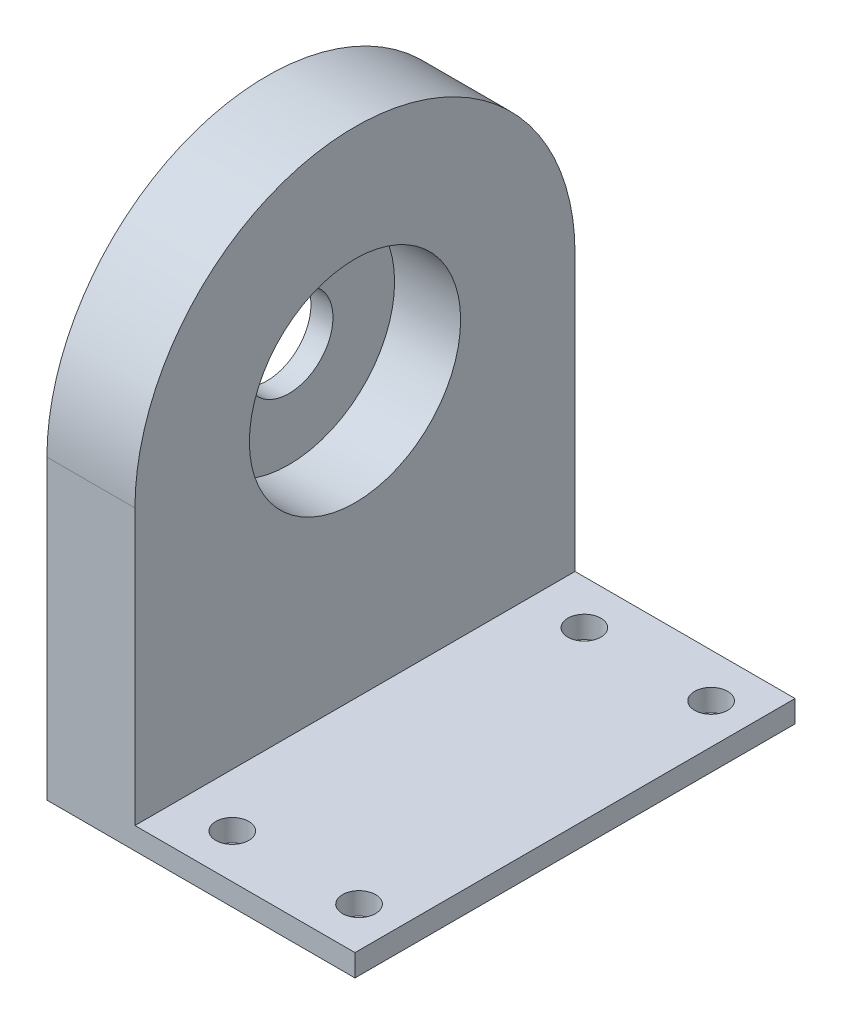
ISO-10303-21;
HEADER;
FILE_DESCRIPTION(('STEP AP214'),'2;1');
FILE_NAME('part.step','',(''),(''),'','','');
FILE_SCHEMA(('AUTOMOTIVE_DESIGN { 1 0 10303 214 1 1 1 1 }'));
ENDSEC;
DATA;
#1=APPLICATION_CONTEXT('core data for automotive mechanical design processes');
#2=APPLICATION_PROTOCOL_DEFINITION('international standard','automotive_design',2000,#1);
#3=PRODUCT_CONTEXT('',#1,'mechanical');
#4=PRODUCT('Part','Part','',(#3));
#5=PRODUCT_RELATED_PRODUCT_CATEGORY('part','',(#4));
#6=PRODUCT_DEFINITION_FORMATION('','',#4);
#7=PRODUCT_DEFINITION_CONTEXT('part definition',#1,'design');
#8=PRODUCT_DEFINITION('design','',#6,#7);
#9=PRODUCT_DEFINITION_SHAPE('','',#8);
#10=(LENGTH_UNIT() NAMED_UNIT(*) SI_UNIT(.MILLI.,.METRE.));
#11=(NAMED_UNIT(*) PLANE_ANGLE_UNIT() SI_UNIT($,.RADIAN.));
#12=(NAMED_UNIT(*) SI_UNIT($,.STERADIAN.) SOLID_ANGLE_UNIT());
#13=UNCERTAINTY_MEASURE_WITH_UNIT(LENGTH_MEASURE(1.E-05),#10,'distance_accuracy_value','');
#14=(GEOMETRIC_REPRESENTATION_CONTEXT(3) GLOBAL_UNCERTAINTY_ASSIGNED_CONTEXT((#13)) GLOBAL_UNIT_ASSIGNED_CONTEXT((#10,
#11,#12)) REPRESENTATION_CONTEXT('',''));
#15=CARTESIAN_POINT('',(0.,0.,0.));
#16=DIRECTION('',(0.,0.,1.));
#17=DIRECTION('',(1.,0.,0.));
#18=AXIS2_PLACEMENT_3D('',#15,#16,#17);
#19=CARTESIAN_POINT('',(-2.,9.08333333333333,5.25));
#20=DIRECTION('',(1.,0.,0.));
#21=DIRECTION('',(0.,0.,-1.));
#22=AXIS2_PLACEMENT_3D('',#19,#20,#21);
#23=CYLINDRICAL_SURFACE('',#22,20.);
#24=DIRECTION('',(1.,0.,0.));
#25=VECTOR('',#24,1.);
#26=CARTESIAN_POINT('',(-2.,9.08333333333333,25.25));
#27=LINE('',#26,#25);
#28=CARTESIAN_POINT('',(-2.,9.08333333333333,25.25));
#29=VERTEX_POINT('',#28);
#30=CARTESIAN_POINT('',(6.,9.08333333333333,25.25));
#31=VERTEX_POINT('',#30);
#32=EDGE_CURVE('E99',#29,#31,#27,.T.);
#33=ORIENTED_EDGE('',*,*,#32,.T.);
#34=CARTESIAN_POINT('',(6.,9.08333333333333,5.25));
#35=DIRECTION('',(1.,0.,0.));
#36=DIRECTION('',(0.,0.,-1.));
#37=AXIS2_PLACEMENT_3D('',#34,#35,#36);
#38=CIRCLE('',#37,20.);
#39=CARTESIAN_POINT('',(6.,9.08333333333333,-14.75));
#40=VERTEX_POINT('',#39);
#41=EDGE_CURVE('E132',#40,#31,#38,.T.);
#42=ORIENTED_EDGE('',*,*,#41,.F.);
#43=DIRECTION('',(1.,0.,0.));
#44=VECTOR('',#43,1.);
#45=CARTESIAN_POINT('',(-2.,9.08333333333333,-14.75));
#46=LINE('',#45,#44);
#47=CARTESIAN_POINT('',(-2.,9.08333333333333,-14.75));
#48=VERTEX_POINT('',#47);
#49=EDGE_CURVE('E11',#48,#40,#46,.T.);
#50=ORIENTED_EDGE('',*,*,#49,.F.);
#51=CARTESIAN_POINT('',(-2.,9.08333333333333,5.25));
#52=DIRECTION('',(1.,0.,0.));
#53=DIRECTION('',(0.,0.,-1.));
#54=AXIS2_PLACEMENT_3D('',#51,#52,#53);
#55=CIRCLE('',#54,20.);
#56=EDGE_CURVE('E141',#48,#29,#55,.T.);
#57=ORIENTED_EDGE('',*,*,#56,.T.);
#58=EDGE_LOOP('',(#33,#42,#50,#57));
#59=FACE_BOUND('',#58,.T.);
#60=ADVANCED_FACE('F34',(#59),#23,.T.);
#61=CARTESIAN_POINT('',(-2.,9.08333333333333,-14.75));
#62=DIRECTION('',(0.,0.,-1.));
#63=DIRECTION('',(-1.,0.,0.));
#64=AXIS2_PLACEMENT_3D('',#61,#62,#63);
#65=PLANE('',#64);
#66=ORIENTED_EDGE('',*,*,#49,.T.);
#67=DIRECTION('',(0.,1.,0.));
#68=VECTOR('',#67,1.);
#69=CARTESIAN_POINT('',(6.,9.08333333333333,-14.75));
#70=LINE('',#69,#68);
#71=CARTESIAN_POINT('',(6.,-15.9166666666667,-14.75));
#72=VERTEX_POINT('',#71);
#73=EDGE_CURVE('E139',#72,#40,#70,.T.);
#74=ORIENTED_EDGE('',*,*,#73,.F.);
#75=DIRECTION('',(-1.,0.,0.));
#76=VECTOR('',#75,1.);
#77=CARTESIAN_POINT('',(26.,-15.9166666666667,-14.75));
#78=LINE('',#77,#76);
#79=CARTESIAN_POINT('',(26.,-15.9166666666667,-14.75));
#80=VERTEX_POINT('',#79);
#81=EDGE_CURVE('E122',#80,#72,#78,.T.);
#82=ORIENTED_EDGE('',*,*,#81,.F.);
#83=DIRECTION('',(0.,1.,0.));
#84=VECTOR('',#83,1.);
#85=CARTESIAN_POINT('',(26.,-17.9166666666667,-14.75));
#86=LINE('',#85,#84);
#87=CARTESIAN_POINT('',(26.,-17.9166666666667,-14.75));
#88=VERTEX_POINT('',#87);
#89=EDGE_CURVE('E106',#88,#80,#86,.T.);
#90=ORIENTED_EDGE('',*,*,#89,.F.);
#91=DIRECTION('',(1.,0.,0.));
#92=VECTOR('',#91,1.);
#93=CARTESIAN_POINT('',(-2.,-17.9166666666667,-14.75));
#94=LINE('',#93,#92);
#95=CARTESIAN_POINT('',(-2.,-17.9166666666667,-14.75));
#96=VERTEX_POINT('',#95);
#97=EDGE_CURVE('E42',#96,#88,#94,.T.);
#98=ORIENTED_EDGE('',*,*,#97,.F.);
#99=DIRECTION('',(0.,1.,0.));
#100=VECTOR('',#99,1.);
#101=CARTESIAN_POINT('',(-2.,9.08333333333333,-14.75));
#102=LINE('',#101,#100);
#103=EDGE_CURVE('E146',#96,#48,#102,.T.);
#104=ORIENTED_EDGE('',*,*,#103,.T.);
#105=EDGE_LOOP('',(#66,#74,#82,#90,#98,#104));
#106=FACE_BOUND('',#105,.T.);
#107=ADVANCED_FACE('F154',(#106),#65,.T.);
#108=CARTESIAN_POINT('',(-2.,-17.9166666666667,25.25));
#109=DIRECTION('',(0.,-1.,0.));
#110=DIRECTION('',(0.,0.,-1.));
#111=AXIS2_PLACEMENT_3D('',#108,#109,#110);
#112=PLANE('',#111);
#113=CARTESIAN_POINT('',(10.8479228596359,-17.9166666666667,21.25));
#114=DIRECTION('',(0.,-1.,0.));
#115=DIRECTION('',(0.,0.,-1.));
#116=AXIS2_PLACEMENT_3D('',#113,#114,#115);
#117=CIRCLE('',#116,1.5);
#118=CARTESIAN_POINT('',(10.8479228596359,-17.9166666666667,19.75));
#119=VERTEX_POINT('',#118);
#120=EDGE_CURVE('E113',#119,#119,#117,.T.);
#121=ORIENTED_EDGE('',*,*,#120,.F.);
#122=EDGE_LOOP('',(#121));
#123=FACE_BOUND('',#122,.T.);
#124=CARTESIAN_POINT('',(22.368694263277,-17.9166666666667,21.25));
#125=DIRECTION('',(0.,-1.,0.));
#126=DIRECTION('',(0.,0.,-1.));
#127=AXIS2_PLACEMENT_3D('',#124,#125,#126);
#128=CIRCLE('',#127,1.5);
#129=CARTESIAN_POINT('',(22.368694263277,-17.9166666666667,19.75));
#130=VERTEX_POINT('',#129);
#131=EDGE_CURVE('E185',#130,#130,#128,.T.);
#132=ORIENTED_EDGE('',*,*,#131,.F.);
#133=EDGE_LOOP('',(#132));
#134=FACE_BOUND('',#133,.T.);
#135=CARTESIAN_POINT('',(22.368694263277,-17.9166666666667,-10.75));
#136=DIRECTION('',(0.,-1.,0.));
#137=DIRECTION('',(0.,0.,-1.));
#138=AXIS2_PLACEMENT_3D('',#135,#136,#137);
#139=CIRCLE('',#138,1.5);
#140=CARTESIAN_POINT('',(22.368694263277,-17.9166666666667,-12.25));
#141=VERTEX_POINT('',#140);
#142=EDGE_CURVE('E189',#141,#141,#139,.T.);
#143=ORIENTED_EDGE('',*,*,#142,.F.);
#144=EDGE_LOOP('',(#143));
#145=FACE_BOUND('',#144,.T.);
#146=CARTESIAN_POINT('',(10.8479228596359,-17.9166666666667,-10.75));
#147=DIRECTION('',(0.,-1.,0.));
#148=DIRECTION('',(0.,0.,-1.));
#149=AXIS2_PLACEMENT_3D('',#146,#147,#148);
#150=CIRCLE('',#149,1.5);
#151=CARTESIAN_POINT('',(10.8479228596359,-17.9166666666667,-12.25));
#152=VERTEX_POINT('',#151);
#153=EDGE_CURVE('E192',#152,#152,#150,.T.);
#154=ORIENTED_EDGE('',*,*,#153,.F.);
#155=EDGE_LOOP('',(#154));
#156=FACE_BOUND('',#155,.T.);
#157=ORIENTED_EDGE('',*,*,#97,.T.);
#158=DIRECTION('',(0.,0.,-1.));
#159=VECTOR('',#158,1.);
#160=CARTESIAN_POINT('',(26.,-17.9166666666667,25.25));
#161=LINE('',#160,#159);
#162=CARTESIAN_POINT('',(26.,-17.9166666666667,25.25));
#163=VERTEX_POINT('',#162);
#164=EDGE_CURVE('E102',#163,#88,#161,.T.);
#165=ORIENTED_EDGE('',*,*,#164,.F.);
#166=DIRECTION('',(1.,0.,0.));
#167=VECTOR('',#166,1.);
#168=CARTESIAN_POINT('',(-2.,-17.9166666666667,25.25));
#169=LINE('',#168,#167);
#170=CARTESIAN_POINT('',(-2.,-17.9166666666667,25.25));
#171=VERTEX_POINT('',#170);
#172=EDGE_CURVE('E88',#171,#163,#169,.T.);
#173=ORIENTED_EDGE('',*,*,#172,.F.);
#174=DIRECTION('',(0.,0.,-1.));
#175=VECTOR('',#174,1.);
#176=CARTESIAN_POINT('',(-2.,-17.9166666666667,25.25));
#177=LINE('',#176,#175);
#178=EDGE_CURVE('E144',#171,#96,#177,.T.);
#179=ORIENTED_EDGE('',*,*,#178,.T.);
#180=EDGE_LOOP('',(#157,#165,#173,#179));
#181=FACE_BOUND('',#180,.T.);
#182=ADVANCED_FACE('F103',(#123,#134,#145,#156,#181),#112,.T.);
#183=CARTESIAN_POINT('',(-2.,9.08333333333333,25.25));
#184=DIRECTION('',(0.,0.,1.));
#185=DIRECTION('',(1.,0.,0.));
#186=AXIS2_PLACEMENT_3D('',#183,#184,#185);
#187=PLANE('',#186);
#188=ORIENTED_EDGE('',*,*,#172,.T.);
#189=DIRECTION('',(0.,-1.,0.));
#190=VECTOR('',#189,1.);
#191=CARTESIAN_POINT('',(26.,-17.9166666666667,25.25));
#192=LINE('',#191,#190);
#193=CARTESIAN_POINT('',(26.,-15.9166666666667,25.25));
#194=VERTEX_POINT('',#193);
#195=EDGE_CURVE('E93',#194,#163,#192,.T.);
#196=ORIENTED_EDGE('',*,*,#195,.F.);
#197=DIRECTION('',(-1.,0.,0.));
#198=VECTOR('',#197,1.);
#199=CARTESIAN_POINT('',(26.,-15.9166666666667,25.25));
#200=LINE('',#199,#198);
#201=CARTESIAN_POINT('',(6.,-15.9166666666667,25.25));
#202=VERTEX_POINT('',#201);
#203=EDGE_CURVE('E119',#194,#202,#200,.T.);
#204=ORIENTED_EDGE('',*,*,#203,.T.);
#205=DIRECTION('',(0.,-1.,0.));
#206=VECTOR('',#205,1.);
#207=CARTESIAN_POINT('',(6.,9.08333333333333,25.25));
#208=LINE('',#207,#206);
#209=EDGE_CURVE('E137',#31,#202,#208,.T.);
#210=ORIENTED_EDGE('',*,*,#209,.F.);
#211=ORIENTED_EDGE('',*,*,#32,.F.);
#212=DIRECTION('',(0.,-1.,0.));
#213=VECTOR('',#212,1.);
#214=CARTESIAN_POINT('',(-2.,9.08333333333333,25.25));
#215=LINE('',#214,#213);
#216=EDGE_CURVE('E95',#29,#171,#215,.T.);
#217=ORIENTED_EDGE('',*,*,#216,.T.);
#218=EDGE_LOOP('',(#188,#196,#204,#210,#211,#217));
#219=FACE_BOUND('',#218,.T.);
#220=ADVANCED_FACE('F90',(#219),#187,.T.);
#221=CARTESIAN_POINT('',(-2.,9.08333333333333,5.25));
#222=DIRECTION('',(1.,0.,0.));
#223=DIRECTION('',(0.,0.,-1.));
#224=AXIS2_PLACEMENT_3D('',#221,#222,#223);
#225=PLANE('',#224);
#226=CARTESIAN_POINT('',(-2.,9.08333333333333,5.25));
#227=DIRECTION('',(1.,0.,0.));
#228=DIRECTION('',(0.,0.,-1.));
#229=AXIS2_PLACEMENT_3D('',#226,#227,#228);
#230=CIRCLE('',#229,4.);
#231=CARTESIAN_POINT('',(-2.,9.08333333333333,1.25));
#232=VERTEX_POINT('',#231);
#233=EDGE_CURVE('E125',#232,#232,#230,.T.);
#234=ORIENTED_EDGE('',*,*,#233,.T.);
#235=EDGE_LOOP('',(#234));
#236=FACE_BOUND('',#235,.T.);
#237=ORIENTED_EDGE('',*,*,#56,.F.);
#238=ORIENTED_EDGE('',*,*,#103,.F.);
#239=ORIENTED_EDGE('',*,*,#178,.F.);
#240=ORIENTED_EDGE('',*,*,#216,.F.);
#241=EDGE_LOOP('',(#237,#238,#239,#240));
#242=FACE_BOUND('',#241,.T.);
#243=ADVANCED_FACE('F157',(#236,#242),#225,.F.);
#244=CARTESIAN_POINT('',(6.,9.08333333333333,5.25));
#245=DIRECTION('',(1.,0.,0.));
#246=DIRECTION('',(0.,0.,-1.));
#247=AXIS2_PLACEMENT_3D('',#244,#245,#246);
#248=PLANE('',#247);
#249=DIRECTION('',(0.,0.,1.));
#250=VECTOR('',#249,1.);
#251=CARTESIAN_POINT('',(6.,-15.9166666666667,25.25));
#252=LINE('',#251,#250);
#253=EDGE_CURVE('E50',#72,#202,#252,.T.);
#254=ORIENTED_EDGE('',*,*,#253,.F.);
#255=ORIENTED_EDGE('',*,*,#73,.T.);
#256=ORIENTED_EDGE('',*,*,#41,.T.);
#257=ORIENTED_EDGE('',*,*,#209,.T.);
#258=EDGE_LOOP('',(#254,#255,#256,#257));
#259=FACE_BOUND('',#258,.T.);
#260=CARTESIAN_POINT('',(6.,9.08333333333333,5.25));
#261=DIRECTION('',(1.,0.,0.));
#262=DIRECTION('',(0.,0.,-1.));
#263=AXIS2_PLACEMENT_3D('',#260,#261,#262);
#264=CIRCLE('',#263,9.6);
#265=CARTESIAN_POINT('',(6.,9.08333333333333,-4.35));
#266=VERTEX_POINT('',#265);
#267=EDGE_CURVE('E128',#266,#266,#264,.T.);
#268=ORIENTED_EDGE('',*,*,#267,.F.);
#269=EDGE_LOOP('',(#268));
#270=FACE_BOUND('',#269,.T.);
#271=ADVANCED_FACE('F150',(#259,#270),#248,.T.);
#272=CARTESIAN_POINT('',(0.,9.08333333333333,5.25));
#273=DIRECTION('',(1.,0.,0.));
#274=DIRECTION('',(0.,0.,-1.));
#275=AXIS2_PLACEMENT_3D('',#272,#273,#274);
#276=CYLINDRICAL_SURFACE('',#275,9.6);
#277=CARTESIAN_POINT('',(0.,9.08333333333333,5.25));
#278=DIRECTION('',(1.,0.,0.));
#279=DIRECTION('',(0.,0.,-1.));
#280=AXIS2_PLACEMENT_3D('',#277,#278,#279);
#281=CIRCLE('',#280,9.6);
#282=CARTESIAN_POINT('',(0.,9.08333333333333,-4.35));
#283=VERTEX_POINT('',#282);
#284=EDGE_CURVE('E129',#283,#283,#281,.T.);
#285=ORIENTED_EDGE('',*,*,#284,.F.);
#286=EDGE_LOOP('',(#285));
#287=FACE_BOUND('',#286,.T.);
#288=ORIENTED_EDGE('',*,*,#267,.T.);
#289=EDGE_LOOP('',(#288));
#290=FACE_BOUND('',#289,.T.);
#291=ADVANCED_FACE('F165',(#287,#290),#276,.F.);
#292=CARTESIAN_POINT('',(0.,0.,0.));
#293=DIRECTION('',(1.,0.,0.));
#294=DIRECTION('',(0.,0.,-1.));
#295=AXIS2_PLACEMENT_3D('',#292,#293,#294);
#296=PLANE('',#295);
#297=CARTESIAN_POINT('',(0.,9.08333333333333,5.25));
#298=DIRECTION('',(1.,0.,0.));
#299=DIRECTION('',(0.,0.,-1.));
#300=AXIS2_PLACEMENT_3D('',#297,#298,#299);
#301=CIRCLE('',#300,4.);
#302=CARTESIAN_POINT('',(0.,9.08333333333333,1.25));
#303=VERTEX_POINT('',#302);
#304=EDGE_CURVE('E37',#303,#303,#301,.T.);
#305=ORIENTED_EDGE('',*,*,#304,.F.);
#306=EDGE_LOOP('',(#305));
#307=FACE_BOUND('',#306,.T.);
#308=ORIENTED_EDGE('',*,*,#284,.T.);
#309=EDGE_LOOP('',(#308));
#310=FACE_BOUND('',#309,.T.);
#311=ADVANCED_FACE('F243',(#307,#310),#296,.T.);
#312=CARTESIAN_POINT('',(-4.,9.08333333333333,5.25));
#313=DIRECTION('',(1.,0.,0.));
#314=DIRECTION('',(0.,0.,-1.));
#315=AXIS2_PLACEMENT_3D('',#312,#313,#314);
#316=CYLINDRICAL_SURFACE('',#315,4.);
#317=ORIENTED_EDGE('',*,*,#304,.T.);
#318=EDGE_LOOP('',(#317));
#319=FACE_BOUND('',#318,.T.);
#320=ORIENTED_EDGE('',*,*,#233,.F.);
#321=EDGE_LOOP('',(#320));
#322=FACE_BOUND('',#321,.T.);
#323=ADVANCED_FACE('F224',(#319,#322),#316,.F.);
#324=CARTESIAN_POINT('',(26.,-15.9166666666667,25.25));
#325=DIRECTION('',(0.,-1.,0.));
#326=DIRECTION('',(0.,0.,-1.));
#327=AXIS2_PLACEMENT_3D('',#324,#325,#326);
#328=PLANE('',#327);
#329=CARTESIAN_POINT('',(10.8479228596359,-15.9166666666667,21.25));
#330=DIRECTION('',(0.,1.,0.));
#331=DIRECTION('',(0.,0.,1.));
#332=AXIS2_PLACEMENT_3D('',#329,#330,#331);
#333=CIRCLE('',#332,1.5);
#334=CARTESIAN_POINT('',(10.8479228596359,-15.9166666666667,22.75));
#335=VERTEX_POINT('',#334);
#336=EDGE_CURVE('E210',#335,#335,#333,.T.);
#337=ORIENTED_EDGE('',*,*,#336,.F.);
#338=EDGE_LOOP('',(#337));
#339=FACE_BOUND('',#338,.T.);
#340=CARTESIAN_POINT('',(22.368694263277,-15.9166666666667,21.25));
#341=DIRECTION('',(0.,1.,0.));
#342=DIRECTION('',(0.,0.,1.));
#343=AXIS2_PLACEMENT_3D('',#340,#341,#342);
#344=CIRCLE('',#343,1.5);
#345=CARTESIAN_POINT('',(22.368694263277,-15.9166666666667,22.75));
#346=VERTEX_POINT('',#345);
#347=EDGE_CURVE('E212',#346,#346,#344,.T.);
#348=ORIENTED_EDGE('',*,*,#347,.F.);
#349=EDGE_LOOP('',(#348));
#350=FACE_BOUND('',#349,.T.);
#351=CARTESIAN_POINT('',(22.368694263277,-15.9166666666667,-10.75));
#352=DIRECTION('',(0.,1.,0.));
#353=DIRECTION('',(0.,0.,1.));
#354=AXIS2_PLACEMENT_3D('',#351,#352,#353);
#355=CIRCLE('',#354,1.5);
#356=CARTESIAN_POINT('',(22.368694263277,-15.9166666666667,-9.25));
#357=VERTEX_POINT('',#356);
#358=EDGE_CURVE('E198',#357,#357,#355,.T.);
#359=ORIENTED_EDGE('',*,*,#358,.F.);
#360=EDGE_LOOP('',(#359));
#361=FACE_BOUND('',#360,.T.);
#362=CARTESIAN_POINT('',(10.8479228596359,-15.9166666666667,-10.75));
#363=DIRECTION('',(0.,1.,0.));
#364=DIRECTION('',(0.,0.,1.));
#365=AXIS2_PLACEMENT_3D('',#362,#363,#364);
#366=CIRCLE('',#365,1.5);
#367=CARTESIAN_POINT('',(10.8479228596359,-15.9166666666667,-9.25));
#368=VERTEX_POINT('',#367);
#369=EDGE_CURVE('E194',#368,#368,#366,.T.);
#370=ORIENTED_EDGE('',*,*,#369,.F.);
#371=EDGE_LOOP('',(#370));
#372=FACE_BOUND('',#371,.T.);
#373=ORIENTED_EDGE('',*,*,#253,.T.);
#374=ORIENTED_EDGE('',*,*,#203,.F.);
#375=DIRECTION('',(0.,0.,1.));
#376=VECTOR('',#375,1.);
#377=CARTESIAN_POINT('',(26.,-15.9166666666667,25.25));
#378=LINE('',#377,#376);
#379=EDGE_CURVE('E110',#80,#194,#378,.T.);
#380=ORIENTED_EDGE('',*,*,#379,.F.);
#381=ORIENTED_EDGE('',*,*,#81,.T.);
#382=EDGE_LOOP('',(#373,#374,#380,#381));
#383=FACE_BOUND('',#382,.T.);
#384=ADVANCED_FACE('F221',(#339,#350,#361,#372,#383),#328,.F.);
#385=CARTESIAN_POINT('',(26.,0.,0.));
#386=DIRECTION('',(-1.,0.,0.));
#387=DIRECTION('',(0.,0.,1.));
#388=AXIS2_PLACEMENT_3D('',#385,#386,#387);
#389=PLANE('',#388);
#390=ORIENTED_EDGE('',*,*,#195,.T.);
#391=ORIENTED_EDGE('',*,*,#164,.T.);
#392=ORIENTED_EDGE('',*,*,#89,.T.);
#393=ORIENTED_EDGE('',*,*,#379,.T.);
#394=EDGE_LOOP('',(#390,#391,#392,#393));
#395=FACE_BOUND('',#394,.T.);
#396=ADVANCED_FACE('F108',(#395),#389,.F.);
#397=CARTESIAN_POINT('',(10.8479228596359,-25.9166666666667,-10.75));
#398=DIRECTION('',(0.,1.,0.));
#399=DIRECTION('',(0.,0.,1.));
#400=AXIS2_PLACEMENT_3D('',#397,#398,#399);
#401=CYLINDRICAL_SURFACE('',#400,1.5);
#402=ORIENTED_EDGE('',*,*,#153,.T.);
#403=EDGE_LOOP('',(#402));
#404=FACE_BOUND('',#403,.T.);
#405=ORIENTED_EDGE('',*,*,#369,.T.);
#406=EDGE_LOOP('',(#405));
#407=FACE_BOUND('',#406,.T.);
#408=ADVANCED_FACE('F229',(#404,#407),#401,.F.);
#409=CARTESIAN_POINT('',(22.368694263277,-25.9166666666667,-10.75));
#410=DIRECTION('',(0.,1.,0.));
#411=DIRECTION('',(0.,0.,1.));
#412=AXIS2_PLACEMENT_3D('',#409,#410,#411);
#413=CYLINDRICAL_SURFACE('',#412,1.5);
#414=ORIENTED_EDGE('',*,*,#142,.T.);
#415=EDGE_LOOP('',(#414));
#416=FACE_BOUND('',#415,.T.);
#417=ORIENTED_EDGE('',*,*,#358,.T.);
#418=EDGE_LOOP('',(#417));
#419=FACE_BOUND('',#418,.T.);
#420=ADVANCED_FACE('F219',(#416,#419),#413,.F.);
#421=CARTESIAN_POINT('',(22.368694263277,-25.9166666666667,21.25));
#422=DIRECTION('',(0.,1.,0.));
#423=DIRECTION('',(0.,0.,1.));
#424=AXIS2_PLACEMENT_3D('',#421,#422,#423);
#425=CYLINDRICAL_SURFACE('',#424,1.5);
#426=ORIENTED_EDGE('',*,*,#131,.T.);
#427=EDGE_LOOP('',(#426));
#428=FACE_BOUND('',#427,.T.);
#429=ORIENTED_EDGE('',*,*,#347,.T.);
#430=EDGE_LOOP('',(#429));
#431=FACE_BOUND('',#430,.T.);
#432=ADVANCED_FACE('F206',(#428,#431),#425,.F.);
#433=CARTESIAN_POINT('',(10.8479228596359,-25.9166666666667,21.25));
#434=DIRECTION('',(0.,1.,0.));
#435=DIRECTION('',(0.,0.,1.));
#436=AXIS2_PLACEMENT_3D('',#433,#434,#435);
#437=CYLINDRICAL_SURFACE('',#436,1.5);
#438=ORIENTED_EDGE('',*,*,#120,.T.);
#439=EDGE_LOOP('',(#438));
#440=FACE_BOUND('',#439,.T.);
#441=ORIENTED_EDGE('',*,*,#336,.T.);
#442=EDGE_LOOP('',(#441));
#443=FACE_BOUND('',#442,.T.);
#444=ADVANCED_FACE('F203',(#440,#443),#437,.F.);
#445=CLOSED_SHELL('',(#60,#107,#182,#220,#243,#271,#291,#311,#323,#384,#396,#408,#420,#432,#444));
#446=MANIFOLD_SOLID_BREP('B2',#445);
#447=ADVANCED_BREP_SHAPE_REPRESENTATION('',(#18,#446),#14);
#448=SHAPE_DEFINITION_REPRESENTATION(#9,#447);
ENDSEC;
END-ISO-10303-21;
